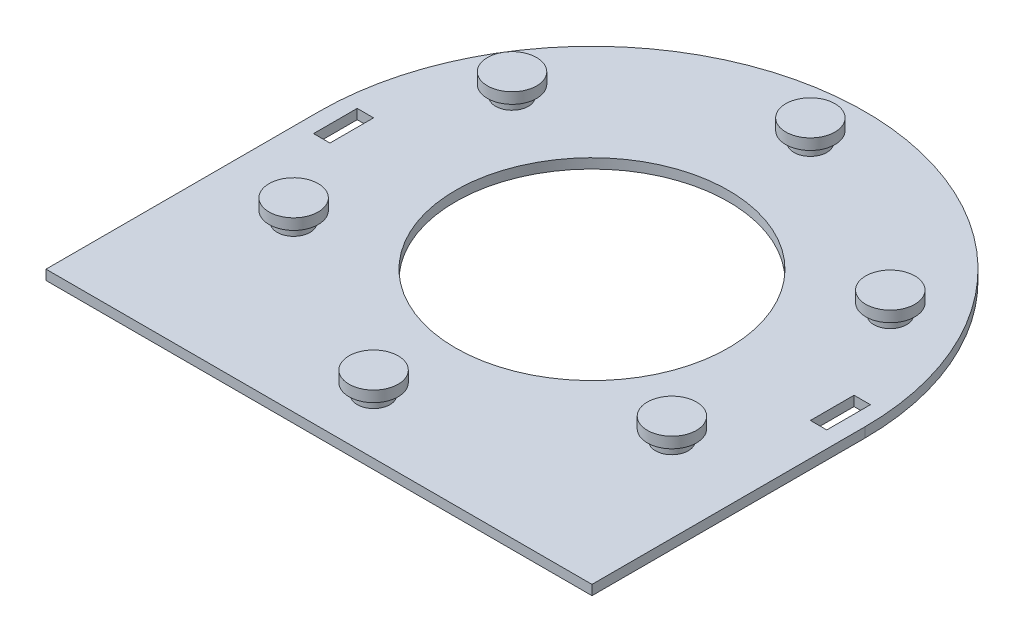
ISO-10303-21;
HEADER;
FILE_DESCRIPTION(('STEP AP214'),'2;1');
FILE_NAME('part.step','',(''),(''),'','','');
FILE_SCHEMA(('AUTOMOTIVE_DESIGN { 1 0 10303 214 1 1 1 1 }'));
ENDSEC;
DATA;
#1=APPLICATION_CONTEXT('core data for automotive mechanical design processes');
#2=APPLICATION_PROTOCOL_DEFINITION('international standard','automotive_design',2000,#1);
#3=PRODUCT_CONTEXT('',#1,'mechanical');
#4=PRODUCT('Part','Part','',(#3));
#5=PRODUCT_RELATED_PRODUCT_CATEGORY('part','',(#4));
#6=PRODUCT_DEFINITION_FORMATION('','',#4);
#7=PRODUCT_DEFINITION_CONTEXT('part definition',#1,'design');
#8=PRODUCT_DEFINITION('design','',#6,#7);
#9=PRODUCT_DEFINITION_SHAPE('','',#8);
#10=(LENGTH_UNIT() NAMED_UNIT(*) SI_UNIT(.MILLI.,.METRE.));
#11=(NAMED_UNIT(*) PLANE_ANGLE_UNIT() SI_UNIT($,.RADIAN.));
#12=(NAMED_UNIT(*) SI_UNIT($,.STERADIAN.) SOLID_ANGLE_UNIT());
#13=UNCERTAINTY_MEASURE_WITH_UNIT(LENGTH_MEASURE(1.E-05),#10,'distance_accuracy_value','');
#14=(GEOMETRIC_REPRESENTATION_CONTEXT(3) GLOBAL_UNCERTAINTY_ASSIGNED_CONTEXT((#13)) GLOBAL_UNIT_ASSIGNED_CONTEXT((#10,
#11,#12)) REPRESENTATION_CONTEXT('',''));
#15=CARTESIAN_POINT('',(0.,0.,0.));
#16=DIRECTION('',(0.,0.,1.));
#17=DIRECTION('',(1.,0.,0.));
#18=AXIS2_PLACEMENT_3D('',#15,#16,#17);
#19=CARTESIAN_POINT('',(50.,1.8,0.));
#20=DIRECTION('',(1.,0.,0.));
#21=DIRECTION('',(0.,0.,-1.));
#22=AXIS2_PLACEMENT_3D('',#19,#20,#21);
#23=PLANE('',#22);
#24=DIRECTION('',(0.,0.,1.));
#25=VECTOR('',#24,1.);
#26=CARTESIAN_POINT('',(50.,0.,0.));
#27=LINE('',#26,#25);
#28=CARTESIAN_POINT('',(50.,0.,0.));
#29=VERTEX_POINT('',#28);
#30=CARTESIAN_POINT('',(50.,0.,50.));
#31=VERTEX_POINT('',#30);
#32=EDGE_CURVE('E301',#29,#31,#27,.T.);
#33=ORIENTED_EDGE('',*,*,#32,.F.);
#34=DIRECTION('',(0.,-1.,0.));
#35=VECTOR('',#34,1.);
#36=CARTESIAN_POINT('',(50.,1.8,0.));
#37=LINE('',#36,#35);
#38=CARTESIAN_POINT('',(50.,1.8,0.));
#39=VERTEX_POINT('',#38);
#40=EDGE_CURVE('E12',#39,#29,#37,.T.);
#41=ORIENTED_EDGE('',*,*,#40,.F.);
#42=DIRECTION('',(0.,0.,1.));
#43=VECTOR('',#42,1.);
#44=CARTESIAN_POINT('',(50.,1.8,0.));
#45=LINE('',#44,#43);
#46=CARTESIAN_POINT('',(50.,1.8,50.));
#47=VERTEX_POINT('',#46);
#48=EDGE_CURVE('E302',#39,#47,#45,.T.);
#49=ORIENTED_EDGE('',*,*,#48,.T.);
#50=DIRECTION('',(0.,-1.,0.));
#51=VECTOR('',#50,1.);
#52=CARTESIAN_POINT('',(50.,1.8,50.));
#53=LINE('',#52,#51);
#54=EDGE_CURVE('E74',#47,#31,#53,.T.);
#55=ORIENTED_EDGE('',*,*,#54,.T.);
#56=EDGE_LOOP('',(#33,#41,#49,#55));
#57=FACE_BOUND('',#56,.T.);
#58=ADVANCED_FACE('F71',(#57),#23,.T.);
#59=CARTESIAN_POINT('',(0.,1.8,0.));
#60=DIRECTION('',(0.,-1.,0.));
#61=DIRECTION('',(0.,0.,-1.));
#62=AXIS2_PLACEMENT_3D('',#59,#60,#61);
#63=CYLINDRICAL_SURFACE('',#62,50.);
#64=CARTESIAN_POINT('',(0.,0.,0.));
#65=DIRECTION('',(0.,1.,0.));
#66=DIRECTION('',(0.,0.,1.));
#67=AXIS2_PLACEMENT_3D('',#64,#65,#66);
#68=CIRCLE('',#67,50.);
#69=CARTESIAN_POINT('',(-50.,0.,0.));
#70=VERTEX_POINT('',#69);
#71=EDGE_CURVE('E306',#29,#70,#68,.T.);
#72=ORIENTED_EDGE('',*,*,#71,.T.);
#73=DIRECTION('',(0.,-1.,0.));
#74=VECTOR('',#73,1.);
#75=CARTESIAN_POINT('',(-50.,1.8,0.));
#76=LINE('',#75,#74);
#77=CARTESIAN_POINT('',(-50.,1.8,0.));
#78=VERTEX_POINT('',#77);
#79=EDGE_CURVE('E79',#78,#70,#76,.T.);
#80=ORIENTED_EDGE('',*,*,#79,.F.);
#81=CARTESIAN_POINT('',(0.,1.8,0.));
#82=DIRECTION('',(0.,1.,0.));
#83=DIRECTION('',(0.,0.,1.));
#84=AXIS2_PLACEMENT_3D('',#81,#82,#83);
#85=CIRCLE('',#84,50.);
#86=EDGE_CURVE('E310',#39,#78,#85,.T.);
#87=ORIENTED_EDGE('',*,*,#86,.F.);
#88=ORIENTED_EDGE('',*,*,#40,.T.);
#89=EDGE_LOOP('',(#72,#80,#87,#88));
#90=FACE_BOUND('',#89,.T.);
#91=ADVANCED_FACE('F338',(#90),#63,.T.);
#92=CARTESIAN_POINT('',(-50.,1.8,0.));
#93=DIRECTION('',(1.,0.,0.));
#94=DIRECTION('',(0.,0.,-1.));
#95=AXIS2_PLACEMENT_3D('',#92,#93,#94);
#96=PLANE('',#95);
#97=DIRECTION('',(0.,0.,1.));
#98=VECTOR('',#97,1.);
#99=CARTESIAN_POINT('',(-50.,0.,0.));
#100=LINE('',#99,#98);
#101=CARTESIAN_POINT('',(-50.,0.,50.));
#102=VERTEX_POINT('',#101);
#103=EDGE_CURVE('E317',#70,#102,#100,.T.);
#104=ORIENTED_EDGE('',*,*,#103,.T.);
#105=DIRECTION('',(0.,-1.,0.));
#106=VECTOR('',#105,1.);
#107=CARTESIAN_POINT('',(-50.,1.8,50.));
#108=LINE('',#107,#106);
#109=CARTESIAN_POINT('',(-50.,1.8,50.));
#110=VERTEX_POINT('',#109);
#111=EDGE_CURVE('E321',#110,#102,#108,.T.);
#112=ORIENTED_EDGE('',*,*,#111,.F.);
#113=DIRECTION('',(0.,0.,1.));
#114=VECTOR('',#113,1.);
#115=CARTESIAN_POINT('',(-50.,1.8,0.));
#116=LINE('',#115,#114);
#117=EDGE_CURVE('E308',#78,#110,#116,.T.);
#118=ORIENTED_EDGE('',*,*,#117,.F.);
#119=ORIENTED_EDGE('',*,*,#79,.T.);
#120=EDGE_LOOP('',(#104,#112,#118,#119));
#121=FACE_BOUND('',#120,.T.);
#122=ADVANCED_FACE('F342',(#121),#96,.F.);
#123=CARTESIAN_POINT('',(-50.,1.8,50.));
#124=DIRECTION('',(0.,0.,-1.));
#125=DIRECTION('',(-1.,0.,0.));
#126=AXIS2_PLACEMENT_3D('',#123,#124,#125);
#127=PLANE('',#126);
#128=DIRECTION('',(1.,0.,0.));
#129=VECTOR('',#128,1.);
#130=CARTESIAN_POINT('',(-50.,0.,50.));
#131=LINE('',#130,#129);
#132=EDGE_CURVE('E314',#102,#31,#131,.T.);
#133=ORIENTED_EDGE('',*,*,#132,.T.);
#134=ORIENTED_EDGE('',*,*,#54,.F.);
#135=DIRECTION('',(1.,0.,0.));
#136=VECTOR('',#135,1.);
#137=CARTESIAN_POINT('',(-50.,1.8,50.));
#138=LINE('',#137,#136);
#139=EDGE_CURVE('E305',#110,#47,#138,.T.);
#140=ORIENTED_EDGE('',*,*,#139,.F.);
#141=ORIENTED_EDGE('',*,*,#111,.T.);
#142=EDGE_LOOP('',(#133,#134,#140,#141));
#143=FACE_BOUND('',#142,.T.);
#144=ADVANCED_FACE('F331',(#143),#127,.F.);
#145=CARTESIAN_POINT('',(0.,1.8,0.));
#146=DIRECTION('',(0.,1.,0.));
#147=DIRECTION('',(0.,0.,1.));
#148=AXIS2_PLACEMENT_3D('',#145,#146,#147);
#149=PLANE('',#148);
#150=DIRECTION('',(0.,0.,1.));
#151=VECTOR('',#150,1.);
#152=CARTESIAN_POINT('',(-47.,1.8,-3.99999999999999));
#153=LINE('',#152,#151);
#154=CARTESIAN_POINT('',(-47.,1.8,-3.99999999999999));
#155=VERTEX_POINT('',#154);
#156=CARTESIAN_POINT('',(-47.,1.8,3.99999999999999));
#157=VERTEX_POINT('',#156);
#158=EDGE_CURVE('E87',#155,#157,#153,.T.);
#159=ORIENTED_EDGE('',*,*,#158,.F.);
#160=DIRECTION('',(-1.,0.,0.));
#161=VECTOR('',#160,1.);
#162=CARTESIAN_POINT('',(-47.,1.8,-3.99999999999999));
#163=LINE('',#162,#161);
#164=CARTESIAN_POINT('',(-44.,1.8,-4.00000000000001));
#165=VERTEX_POINT('',#164);
#166=EDGE_CURVE('E184',#165,#155,#163,.T.);
#167=ORIENTED_EDGE('',*,*,#166,.F.);
#168=DIRECTION('',(0.,0.,-1.));
#169=VECTOR('',#168,1.);
#170=CARTESIAN_POINT('',(-44.,1.8,-4.00000000000001));
#171=LINE('',#170,#169);
#172=CARTESIAN_POINT('',(-44.,1.8,3.99999999999999));
#173=VERTEX_POINT('',#172);
#174=EDGE_CURVE('E167',#173,#165,#171,.T.);
#175=ORIENTED_EDGE('',*,*,#174,.F.);
#176=DIRECTION('',(1.,0.,0.));
#177=VECTOR('',#176,1.);
#178=CARTESIAN_POINT('',(-47.,1.8,3.99999999999999));
#179=LINE('',#178,#177);
#180=EDGE_CURVE('E177',#157,#173,#179,.T.);
#181=ORIENTED_EDGE('',*,*,#180,.F.);
#182=EDGE_LOOP('',(#159,#167,#175,#181));
#183=FACE_BOUND('',#182,.T.);
#184=DIRECTION('',(0.,0.,-1.));
#185=VECTOR('',#184,1.);
#186=CARTESIAN_POINT('',(47.,1.8,-3.99999999999999));
#187=LINE('',#186,#185);
#188=CARTESIAN_POINT('',(47.,1.8,3.99999999999999));
#189=VERTEX_POINT('',#188);
#190=CARTESIAN_POINT('',(47.,1.8,-3.99999999999999));
#191=VERTEX_POINT('',#190);
#192=EDGE_CURVE('E95',#189,#191,#187,.T.);
#193=ORIENTED_EDGE('',*,*,#192,.F.);
#194=DIRECTION('',(1.,0.,0.));
#195=VECTOR('',#194,1.);
#196=CARTESIAN_POINT('',(47.,1.8,3.99999999999999));
#197=LINE('',#196,#195);
#198=CARTESIAN_POINT('',(44.,1.8,3.99999999999999));
#199=VERTEX_POINT('',#198);
#200=EDGE_CURVE('E213',#199,#189,#197,.T.);
#201=ORIENTED_EDGE('',*,*,#200,.F.);
#202=DIRECTION('',(0.,0.,1.));
#203=VECTOR('',#202,1.);
#204=CARTESIAN_POINT('',(44.,1.8,-4.00000000000001));
#205=LINE('',#204,#203);
#206=CARTESIAN_POINT('',(44.,1.8,-4.00000000000001));
#207=VERTEX_POINT('',#206);
#208=EDGE_CURVE('E210',#207,#199,#205,.T.);
#209=ORIENTED_EDGE('',*,*,#208,.F.);
#210=DIRECTION('',(-1.,0.,0.));
#211=VECTOR('',#210,1.);
#212=CARTESIAN_POINT('',(47.,1.8,-3.99999999999999));
#213=LINE('',#212,#211);
#214=EDGE_CURVE('E207',#191,#207,#213,.T.);
#215=ORIENTED_EDGE('',*,*,#214,.F.);
#216=EDGE_LOOP('',(#193,#201,#209,#215));
#217=FACE_BOUND('',#216,.T.);
#218=CARTESIAN_POINT('',(0.,1.8,0.));
#219=DIRECTION('',(0.,1.,0.));
#220=DIRECTION('',(0.,0.,1.));
#221=AXIS2_PLACEMENT_3D('',#218,#219,#220);
#222=CIRCLE('',#221,25.);
#223=CARTESIAN_POINT('',(0.,1.8,25.));
#224=VERTEX_POINT('',#223);
#225=EDGE_CURVE('E295',#224,#224,#222,.T.);
#226=ORIENTED_EDGE('',*,*,#225,.F.);
#227=EDGE_LOOP('',(#226));
#228=FACE_BOUND('',#227,.T.);
#229=ORIENTED_EDGE('',*,*,#48,.F.);
#230=ORIENTED_EDGE('',*,*,#86,.T.);
#231=ORIENTED_EDGE('',*,*,#117,.T.);
#232=ORIENTED_EDGE('',*,*,#139,.T.);
#233=EDGE_LOOP('',(#229,#230,#231,#232));
#234=FACE_BOUND('',#233,.T.);
#235=CARTESIAN_POINT('',(0.,1.8,40.));
#236=DIRECTION('',(0.,1.,0.));
#237=DIRECTION('',(0.,0.,1.));
#238=AXIS2_PLACEMENT_3D('',#235,#236,#237);
#239=CIRCLE('',#238,3.);
#240=CARTESIAN_POINT('',(0.,1.8,43.));
#241=VERTEX_POINT('',#240);
#242=EDGE_CURVE('E283',#241,#241,#239,.T.);
#243=ORIENTED_EDGE('',*,*,#242,.F.);
#244=EDGE_LOOP('',(#243));
#245=FACE_BOUND('',#244,.T.);
#246=CARTESIAN_POINT('',(-34.6410161513773,1.8,20.0000000000004));
#247=DIRECTION('',(0.,1.,0.));
#248=DIRECTION('',(-0.866025403784433,0.,0.50000000000001));
#249=AXIS2_PLACEMENT_3D('',#246,#247,#248);
#250=CIRCLE('',#249,3.);
#251=CARTESIAN_POINT('',(-37.2390923627306,1.8,21.5000000000004));
#252=VERTEX_POINT('',#251);
#253=EDGE_CURVE('E195',#252,#252,#250,.T.);
#254=ORIENTED_EDGE('',*,*,#253,.F.);
#255=EDGE_LOOP('',(#254));
#256=FACE_BOUND('',#255,.T.);
#257=CARTESIAN_POINT('',(-34.6410161513777,1.8,-19.9999999999997));
#258=DIRECTION('',(0.,1.,0.));
#259=DIRECTION('',(-0.866025403784443,0.,-0.499999999999992));
#260=AXIS2_PLACEMENT_3D('',#257,#258,#259);
#261=CIRCLE('',#260,3.);
#262=CARTESIAN_POINT('',(-37.2390923627311,1.8,-21.4999999999997));
#263=VERTEX_POINT('',#262);
#264=EDGE_CURVE('E247',#263,#263,#261,.T.);
#265=ORIENTED_EDGE('',*,*,#264,.F.);
#266=EDGE_LOOP('',(#265));
#267=FACE_BOUND('',#266,.T.);
#268=CARTESIAN_POINT('',(0.,1.8,-40.));
#269=DIRECTION('',(0.,1.,0.));
#270=DIRECTION('',(0.,0.,-1.));
#271=AXIS2_PLACEMENT_3D('',#268,#269,#270);
#272=CIRCLE('',#271,3.);
#273=CARTESIAN_POINT('',(0.,1.8,-43.));
#274=VERTEX_POINT('',#273);
#275=EDGE_CURVE('E238',#274,#274,#272,.T.);
#276=ORIENTED_EDGE('',*,*,#275,.F.);
#277=EDGE_LOOP('',(#276));
#278=FACE_BOUND('',#277,.T.);
#279=CARTESIAN_POINT('',(34.6410161513775,1.8,-20.0000000000002));
#280=DIRECTION('',(0.,1.,0.));
#281=DIRECTION('',(0.866025403784436,0.,-0.500000000000004));
#282=AXIS2_PLACEMENT_3D('',#279,#280,#281);
#283=CIRCLE('',#282,3.);
#284=CARTESIAN_POINT('',(37.2390923627308,1.8,-21.5000000000002));
#285=VERTEX_POINT('',#284);
#286=EDGE_CURVE('E228',#285,#285,#283,.T.);
#287=ORIENTED_EDGE('',*,*,#286,.F.);
#288=EDGE_LOOP('',(#287));
#289=FACE_BOUND('',#288,.T.);
#290=CARTESIAN_POINT('',(34.6410161513776,1.8,19.9999999999999));
#291=DIRECTION('',(0.,1.,0.));
#292=DIRECTION('',(0.86602540378444,0.,0.499999999999998));
#293=AXIS2_PLACEMENT_3D('',#290,#291,#292);
#294=CIRCLE('',#293,3.);
#295=CARTESIAN_POINT('',(37.2390923627309,1.8,21.4999999999999));
#296=VERTEX_POINT('',#295);
#297=EDGE_CURVE('E234',#296,#296,#294,.T.);
#298=ORIENTED_EDGE('',*,*,#297,.F.);
#299=EDGE_LOOP('',(#298));
#300=FACE_BOUND('',#299,.T.);
#301=ADVANCED_FACE('F181',(#183,#217,#228,#234,#245,#256,#267,#278,#289,#300),#149,.T.);
#302=CARTESIAN_POINT('',(0.,0.,0.));
#303=DIRECTION('',(0.,1.,0.));
#304=DIRECTION('',(0.,0.,1.));
#305=AXIS2_PLACEMENT_3D('',#302,#303,#304);
#306=PLANE('',#305);
#307=DIRECTION('',(1.,0.,0.));
#308=VECTOR('',#307,1.);
#309=CARTESIAN_POINT('',(-47.,0.,-3.99999999999999));
#310=LINE('',#309,#308);
#311=CARTESIAN_POINT('',(-47.,0.,-3.99999999999999));
#312=VERTEX_POINT('',#311);
#313=CARTESIAN_POINT('',(-44.,0.,-4.00000000000001));
#314=VERTEX_POINT('',#313);
#315=EDGE_CURVE('E671',#312,#314,#310,.T.);
#316=ORIENTED_EDGE('',*,*,#315,.F.);
#317=DIRECTION('',(0.,0.,-1.));
#318=VECTOR('',#317,1.);
#319=CARTESIAN_POINT('',(-47.,0.,-3.99999999999999));
#320=LINE('',#319,#318);
#321=CARTESIAN_POINT('',(-47.,0.,3.99999999999999));
#322=VERTEX_POINT('',#321);
#323=EDGE_CURVE('E196',#322,#312,#320,.T.);
#324=ORIENTED_EDGE('',*,*,#323,.F.);
#325=DIRECTION('',(-1.,0.,0.));
#326=VECTOR('',#325,1.);
#327=CARTESIAN_POINT('',(-47.,0.,3.99999999999999));
#328=LINE('',#327,#326);
#329=CARTESIAN_POINT('',(-44.,0.,3.99999999999999));
#330=VERTEX_POINT('',#329);
#331=EDGE_CURVE('E193',#330,#322,#328,.T.);
#332=ORIENTED_EDGE('',*,*,#331,.F.);
#333=DIRECTION('',(0.,0.,1.));
#334=VECTOR('',#333,1.);
#335=CARTESIAN_POINT('',(-44.,0.,-4.00000000000001));
#336=LINE('',#335,#334);
#337=EDGE_CURVE('E170',#314,#330,#336,.T.);
#338=ORIENTED_EDGE('',*,*,#337,.F.);
#339=EDGE_LOOP('',(#316,#324,#332,#338));
#340=FACE_BOUND('',#339,.T.);
#341=DIRECTION('',(-1.,0.,0.));
#342=VECTOR('',#341,1.);
#343=CARTESIAN_POINT('',(47.,0.,3.99999999999999));
#344=LINE('',#343,#342);
#345=CARTESIAN_POINT('',(47.,0.,3.99999999999999));
#346=VERTEX_POINT('',#345);
#347=CARTESIAN_POINT('',(44.,0.,3.99999999999999));
#348=VERTEX_POINT('',#347);
#349=EDGE_CURVE('E200',#346,#348,#344,.T.);
#350=ORIENTED_EDGE('',*,*,#349,.F.);
#351=DIRECTION('',(0.,0.,1.));
#352=VECTOR('',#351,1.);
#353=CARTESIAN_POINT('',(47.,0.,-3.99999999999999));
#354=LINE('',#353,#352);
#355=CARTESIAN_POINT('',(47.,0.,-3.99999999999999));
#356=VERTEX_POINT('',#355);
#357=EDGE_CURVE('E203',#356,#346,#354,.T.);
#358=ORIENTED_EDGE('',*,*,#357,.F.);
#359=DIRECTION('',(1.,0.,0.));
#360=VECTOR('',#359,1.);
#361=CARTESIAN_POINT('',(47.,0.,-3.99999999999999));
#362=LINE('',#361,#360);
#363=CARTESIAN_POINT('',(44.,0.,-4.00000000000001));
#364=VERTEX_POINT('',#363);
#365=EDGE_CURVE('E205',#364,#356,#362,.T.);
#366=ORIENTED_EDGE('',*,*,#365,.F.);
#367=DIRECTION('',(0.,0.,-1.));
#368=VECTOR('',#367,1.);
#369=CARTESIAN_POINT('',(44.,0.,-4.00000000000001));
#370=LINE('',#369,#368);
#371=EDGE_CURVE('E197',#348,#364,#370,.T.);
#372=ORIENTED_EDGE('',*,*,#371,.F.);
#373=EDGE_LOOP('',(#350,#358,#366,#372));
#374=FACE_BOUND('',#373,.T.);
#375=CARTESIAN_POINT('',(0.,0.,0.));
#376=DIRECTION('',(0.,1.,0.));
#377=DIRECTION('',(0.,0.,1.));
#378=AXIS2_PLACEMENT_3D('',#375,#376,#377);
#379=CIRCLE('',#378,25.);
#380=CARTESIAN_POINT('',(0.,0.,25.));
#381=VERTEX_POINT('',#380);
#382=EDGE_CURVE('E298',#381,#381,#379,.F.);
#383=ORIENTED_EDGE('',*,*,#382,.F.);
#384=EDGE_LOOP('',(#383));
#385=FACE_BOUND('',#384,.T.);
#386=ORIENTED_EDGE('',*,*,#32,.T.);
#387=ORIENTED_EDGE('',*,*,#132,.F.);
#388=ORIENTED_EDGE('',*,*,#103,.F.);
#389=ORIENTED_EDGE('',*,*,#71,.F.);
#390=EDGE_LOOP('',(#386,#387,#388,#389));
#391=FACE_BOUND('',#390,.T.);
#392=ADVANCED_FACE('F335',(#340,#374,#385,#391),#306,.F.);
#393=CARTESIAN_POINT('',(0.,-70.7106781186548,0.));
#394=DIRECTION('',(0.,1.,0.));
#395=DIRECTION('',(0.,0.,1.));
#396=AXIS2_PLACEMENT_3D('',#393,#394,#395);
#397=CYLINDRICAL_SURFACE('',#396,25.);
#398=ORIENTED_EDGE('',*,*,#382,.T.);
#399=EDGE_LOOP('',(#398));
#400=FACE_BOUND('',#399,.T.);
#401=ORIENTED_EDGE('',*,*,#225,.T.);
#402=EDGE_LOOP('',(#401));
#403=FACE_BOUND('',#402,.T.);
#404=ADVANCED_FACE('F404',(#400,#403),#397,.F.);
#405=CARTESIAN_POINT('',(0.,3.8,40.));
#406=DIRECTION('',(0.,1.,0.));
#407=DIRECTION('',(0.,0.,1.));
#408=AXIS2_PLACEMENT_3D('',#405,#406,#407);
#409=PLANE('',#408);
#410=CARTESIAN_POINT('',(0.,3.8,40.));
#411=DIRECTION('',(0.,1.,0.));
#412=DIRECTION('',(0.,0.,1.));
#413=AXIS2_PLACEMENT_3D('',#410,#411,#412);
#414=CIRCLE('',#413,4.5);
#415=CARTESIAN_POINT('',(0.,3.8,44.5));
#416=VERTEX_POINT('',#415);
#417=EDGE_CURVE('E287',#416,#416,#414,.T.);
#418=ORIENTED_EDGE('',*,*,#417,.F.);
#419=EDGE_LOOP('',(#418));
#420=FACE_BOUND('',#419,.T.);
#421=CARTESIAN_POINT('',(0.,3.8,40.));
#422=DIRECTION('',(0.,1.,0.));
#423=DIRECTION('',(0.,0.,1.));
#424=AXIS2_PLACEMENT_3D('',#421,#422,#423);
#425=CIRCLE('',#424,3.);
#426=CARTESIAN_POINT('',(0.,3.8,43.));
#427=VERTEX_POINT('',#426);
#428=EDGE_CURVE('E284',#427,#427,#425,.T.);
#429=ORIENTED_EDGE('',*,*,#428,.T.);
#430=EDGE_LOOP('',(#429));
#431=FACE_BOUND('',#430,.T.);
#432=ADVANCED_FACE('F411',(#420,#431),#409,.F.);
#433=CARTESIAN_POINT('',(0.,3.8,40.));
#434=DIRECTION('',(0.,-1.,0.));
#435=DIRECTION('',(0.,0.,-1.));
#436=AXIS2_PLACEMENT_3D('',#433,#434,#435);
#437=CYLINDRICAL_SURFACE('',#436,3.);
#438=ORIENTED_EDGE('',*,*,#428,.F.);
#439=EDGE_LOOP('',(#438));
#440=FACE_BOUND('',#439,.T.);
#441=ORIENTED_EDGE('',*,*,#242,.T.);
#442=EDGE_LOOP('',(#441));
#443=FACE_BOUND('',#442,.T.);
#444=ADVANCED_FACE('F420',(#440,#443),#437,.T.);
#445=CARTESIAN_POINT('',(0.,5.8,40.));
#446=DIRECTION('',(0.,1.,0.));
#447=DIRECTION('',(0.,0.,1.));
#448=AXIS2_PLACEMENT_3D('',#445,#446,#447);
#449=PLANE('',#448);
#450=CARTESIAN_POINT('',(0.,5.8,40.));
#451=DIRECTION('',(0.,1.,0.));
#452=DIRECTION('',(0.,0.,1.));
#453=AXIS2_PLACEMENT_3D('',#450,#451,#452);
#454=CIRCLE('',#453,4.5);
#455=CARTESIAN_POINT('',(0.,5.8,44.5));
#456=VERTEX_POINT('',#455);
#457=EDGE_CURVE('E292',#456,#456,#454,.T.);
#458=ORIENTED_EDGE('',*,*,#457,.T.);
#459=EDGE_LOOP('',(#458));
#460=FACE_BOUND('',#459,.T.);
#461=ADVANCED_FACE('F428',(#460),#449,.T.);
#462=CARTESIAN_POINT('',(0.,5.8,40.));
#463=DIRECTION('',(0.,-1.,0.));
#464=DIRECTION('',(0.,0.,-1.));
#465=AXIS2_PLACEMENT_3D('',#462,#463,#464);
#466=CYLINDRICAL_SURFACE('',#465,4.5);
#467=ORIENTED_EDGE('',*,*,#417,.T.);
#468=EDGE_LOOP('',(#467));
#469=FACE_BOUND('',#468,.T.);
#470=ORIENTED_EDGE('',*,*,#457,.F.);
#471=EDGE_LOOP('',(#470));
#472=FACE_BOUND('',#471,.T.);
#473=ADVANCED_FACE('F436',(#469,#472),#466,.T.);
#474=CARTESIAN_POINT('',(-34.6410161513773,3.8,20.0000000000004));
#475=DIRECTION('',(0.,1.,0.));
#476=DIRECTION('',(-0.866025403784433,0.,0.50000000000001));
#477=AXIS2_PLACEMENT_3D('',#474,#475,#476);
#478=PLANE('',#477);
#479=CARTESIAN_POINT('',(-34.6410161513773,3.8,20.0000000000004));
#480=DIRECTION('',(0.,1.,0.));
#481=DIRECTION('',(-0.866025403784433,0.,0.50000000000001));
#482=AXIS2_PLACEMENT_3D('',#479,#480,#481);
#483=CIRCLE('',#482,4.5);
#484=CARTESIAN_POINT('',(-38.5381304684073,3.8,22.2500000000004));
#485=VERTEX_POINT('',#484);
#486=EDGE_CURVE('E250',#485,#485,#483,.T.);
#487=ORIENTED_EDGE('',*,*,#486,.F.);
#488=EDGE_LOOP('',(#487));
#489=FACE_BOUND('',#488,.T.);
#490=CARTESIAN_POINT('',(-34.6410161513773,3.8,20.0000000000004));
#491=DIRECTION('',(0.,1.,0.));
#492=DIRECTION('',(-0.866025403784433,0.,0.50000000000001));
#493=AXIS2_PLACEMENT_3D('',#490,#491,#492);
#494=CIRCLE('',#493,3.);
#495=CARTESIAN_POINT('',(-37.2390923627306,3.8,21.5000000000004));
#496=VERTEX_POINT('',#495);
#497=EDGE_CURVE('E253',#496,#496,#494,.T.);
#498=ORIENTED_EDGE('',*,*,#497,.T.);
#499=EDGE_LOOP('',(#498));
#500=FACE_BOUND('',#499,.T.);
#501=ADVANCED_FACE('F443',(#489,#500),#478,.F.);
#502=CARTESIAN_POINT('',(-34.6410161513773,3.8,20.0000000000004));
#503=DIRECTION('',(0.,-1.,0.));
#504=DIRECTION('',(0.,0.,-1.));
#505=AXIS2_PLACEMENT_3D('',#502,#503,#504);
#506=CYLINDRICAL_SURFACE('',#505,3.);
#507=ORIENTED_EDGE('',*,*,#497,.F.);
#508=EDGE_LOOP('',(#507));
#509=FACE_BOUND('',#508,.T.);
#510=ORIENTED_EDGE('',*,*,#253,.T.);
#511=EDGE_LOOP('',(#510));
#512=FACE_BOUND('',#511,.T.);
#513=ADVANCED_FACE('F451',(#509,#512),#506,.T.);
#514=CARTESIAN_POINT('',(-34.6410161513773,5.8,20.0000000000004));
#515=DIRECTION('',(0.,1.,0.));
#516=DIRECTION('',(-0.866025403784433,0.,0.50000000000001));
#517=AXIS2_PLACEMENT_3D('',#514,#515,#516);
#518=PLANE('',#517);
#519=CARTESIAN_POINT('',(-34.6410161513773,5.8,20.0000000000004));
#520=DIRECTION('',(0.,1.,0.));
#521=DIRECTION('',(-0.866025403784433,0.,0.50000000000001));
#522=AXIS2_PLACEMENT_3D('',#519,#520,#521);
#523=CIRCLE('',#522,4.5);
#524=CARTESIAN_POINT('',(-38.5381304684073,5.8,22.2500000000004));
#525=VERTEX_POINT('',#524);
#526=EDGE_CURVE('E268',#525,#525,#523,.T.);
#527=ORIENTED_EDGE('',*,*,#526,.T.);
#528=EDGE_LOOP('',(#527));
#529=FACE_BOUND('',#528,.T.);
#530=ADVANCED_FACE('F458',(#529),#518,.T.);
#531=CARTESIAN_POINT('',(-34.6410161513773,5.8,20.0000000000004));
#532=DIRECTION('',(0.,-1.,0.));
#533=DIRECTION('',(0.,0.,-1.));
#534=AXIS2_PLACEMENT_3D('',#531,#532,#533);
#535=CYLINDRICAL_SURFACE('',#534,4.5);
#536=ORIENTED_EDGE('',*,*,#486,.T.);
#537=EDGE_LOOP('',(#536));
#538=FACE_BOUND('',#537,.T.);
#539=ORIENTED_EDGE('',*,*,#526,.F.);
#540=EDGE_LOOP('',(#539));
#541=FACE_BOUND('',#540,.T.);
#542=ADVANCED_FACE('F466',(#538,#541),#535,.T.);
#543=CARTESIAN_POINT('',(-34.6410161513777,3.8,-19.9999999999997));
#544=DIRECTION('',(0.,1.,0.));
#545=DIRECTION('',(-0.866025403784443,0.,-0.499999999999992));
#546=AXIS2_PLACEMENT_3D('',#543,#544,#545);
#547=PLANE('',#546);
#548=CARTESIAN_POINT('',(-34.6410161513777,3.8,-19.9999999999997));
#549=DIRECTION('',(0.,1.,0.));
#550=DIRECTION('',(-0.866025403784443,0.,-0.499999999999992));
#551=AXIS2_PLACEMENT_3D('',#548,#549,#550);
#552=CIRCLE('',#551,4.5);
#553=CARTESIAN_POINT('',(-38.5381304684077,3.8,-22.2499999999996));
#554=VERTEX_POINT('',#553);
#555=EDGE_CURVE('E241',#554,#554,#552,.T.);
#556=ORIENTED_EDGE('',*,*,#555,.F.);
#557=EDGE_LOOP('',(#556));
#558=FACE_BOUND('',#557,.T.);
#559=CARTESIAN_POINT('',(-34.6410161513777,3.8,-19.9999999999997));
#560=DIRECTION('',(0.,1.,0.));
#561=DIRECTION('',(-0.866025403784443,0.,-0.499999999999992));
#562=AXIS2_PLACEMENT_3D('',#559,#560,#561);
#563=CIRCLE('',#562,3.);
#564=CARTESIAN_POINT('',(-37.2390923627311,3.8,-21.4999999999997));
#565=VERTEX_POINT('',#564);
#566=EDGE_CURVE('E244',#565,#565,#563,.T.);
#567=ORIENTED_EDGE('',*,*,#566,.T.);
#568=EDGE_LOOP('',(#567));
#569=FACE_BOUND('',#568,.T.);
#570=ADVANCED_FACE('F474',(#558,#569),#547,.F.);
#571=CARTESIAN_POINT('',(-34.6410161513777,3.8,-19.9999999999997));
#572=DIRECTION('',(0.,-1.,0.));
#573=DIRECTION('',(0.,0.,-1.));
#574=AXIS2_PLACEMENT_3D('',#571,#572,#573);
#575=CYLINDRICAL_SURFACE('',#574,3.);
#576=ORIENTED_EDGE('',*,*,#566,.F.);
#577=EDGE_LOOP('',(#576));
#578=FACE_BOUND('',#577,.T.);
#579=ORIENTED_EDGE('',*,*,#264,.T.);
#580=EDGE_LOOP('',(#579));
#581=FACE_BOUND('',#580,.T.);
#582=ADVANCED_FACE('F482',(#578,#581),#575,.T.);
#583=CARTESIAN_POINT('',(-34.6410161513777,5.8,-19.9999999999997));
#584=DIRECTION('',(0.,1.,0.));
#585=DIRECTION('',(-0.866025403784443,0.,-0.499999999999992));
#586=AXIS2_PLACEMENT_3D('',#583,#584,#585);
#587=PLANE('',#586);
#588=CARTESIAN_POINT('',(-34.6410161513777,5.8,-19.9999999999997));
#589=DIRECTION('',(0.,1.,0.));
#590=DIRECTION('',(-0.866025403784443,0.,-0.499999999999992));
#591=AXIS2_PLACEMENT_3D('',#588,#589,#590);
#592=CIRCLE('',#591,4.5);
#593=CARTESIAN_POINT('',(-38.5381304684077,5.8,-22.2499999999996));
#594=VERTEX_POINT('',#593);
#595=EDGE_CURVE('E271',#594,#594,#592,.T.);
#596=ORIENTED_EDGE('',*,*,#595,.T.);
#597=EDGE_LOOP('',(#596));
#598=FACE_BOUND('',#597,.T.);
#599=ADVANCED_FACE('F490',(#598),#587,.T.);
#600=CARTESIAN_POINT('',(-34.6410161513777,5.8,-19.9999999999997));
#601=DIRECTION('',(0.,-1.,0.));
#602=DIRECTION('',(0.,0.,-1.));
#603=AXIS2_PLACEMENT_3D('',#600,#601,#602);
#604=CYLINDRICAL_SURFACE('',#603,4.5);
#605=ORIENTED_EDGE('',*,*,#555,.T.);
#606=EDGE_LOOP('',(#605));
#607=FACE_BOUND('',#606,.T.);
#608=ORIENTED_EDGE('',*,*,#595,.F.);
#609=EDGE_LOOP('',(#608));
#610=FACE_BOUND('',#609,.T.);
#611=ADVANCED_FACE('F498',(#607,#610),#604,.T.);
#612=CARTESIAN_POINT('',(0.,3.8,-40.));
#613=DIRECTION('',(0.,1.,0.));
#614=DIRECTION('',(0.,0.,-1.));
#615=AXIS2_PLACEMENT_3D('',#612,#613,#614);
#616=PLANE('',#615);
#617=CARTESIAN_POINT('',(0.,3.8,-40.));
#618=DIRECTION('',(0.,1.,0.));
#619=DIRECTION('',(0.,0.,-1.));
#620=AXIS2_PLACEMENT_3D('',#617,#618,#619);
#621=CIRCLE('',#620,4.5);
#622=CARTESIAN_POINT('',(0.,3.8,-44.5));
#623=VERTEX_POINT('',#622);
#624=EDGE_CURVE('E231',#623,#623,#621,.T.);
#625=ORIENTED_EDGE('',*,*,#624,.F.);
#626=EDGE_LOOP('',(#625));
#627=FACE_BOUND('',#626,.T.);
#628=CARTESIAN_POINT('',(0.,3.8,-40.));
#629=DIRECTION('',(0.,1.,0.));
#630=DIRECTION('',(0.,0.,-1.));
#631=AXIS2_PLACEMENT_3D('',#628,#629,#630);
#632=CIRCLE('',#631,3.);
#633=CARTESIAN_POINT('',(0.,3.8,-43.));
#634=VERTEX_POINT('',#633);
#635=EDGE_CURVE('E235',#634,#634,#632,.T.);
#636=ORIENTED_EDGE('',*,*,#635,.T.);
#637=EDGE_LOOP('',(#636));
#638=FACE_BOUND('',#637,.T.);
#639=ADVANCED_FACE('F506',(#627,#638),#616,.F.);
#640=CARTESIAN_POINT('',(0.,3.8,-40.));
#641=DIRECTION('',(0.,-1.,0.));
#642=DIRECTION('',(0.,0.,-1.));
#643=AXIS2_PLACEMENT_3D('',#640,#641,#642);
#644=CYLINDRICAL_SURFACE('',#643,3.);
#645=ORIENTED_EDGE('',*,*,#635,.F.);
#646=EDGE_LOOP('',(#645));
#647=FACE_BOUND('',#646,.T.);
#648=ORIENTED_EDGE('',*,*,#275,.T.);
#649=EDGE_LOOP('',(#648));
#650=FACE_BOUND('',#649,.T.);
#651=ADVANCED_FACE('F514',(#647,#650),#644,.T.);
#652=CARTESIAN_POINT('',(0.,5.8,-40.));
#653=DIRECTION('',(0.,1.,0.));
#654=DIRECTION('',(0.,0.,-1.));
#655=AXIS2_PLACEMENT_3D('',#652,#653,#654);
#656=PLANE('',#655);
#657=CARTESIAN_POINT('',(0.,5.8,-40.));
#658=DIRECTION('',(0.,1.,0.));
#659=DIRECTION('',(0.,0.,-1.));
#660=AXIS2_PLACEMENT_3D('',#657,#658,#659);
#661=CIRCLE('',#660,4.5);
#662=CARTESIAN_POINT('',(0.,5.8,-44.5));
#663=VERTEX_POINT('',#662);
#664=EDGE_CURVE('E274',#663,#663,#661,.T.);
#665=ORIENTED_EDGE('',*,*,#664,.T.);
#666=EDGE_LOOP('',(#665));
#667=FACE_BOUND('',#666,.T.);
#668=ADVANCED_FACE('F522',(#667),#656,.T.);
#669=CARTESIAN_POINT('',(0.,5.8,-40.));
#670=DIRECTION('',(0.,-1.,0.));
#671=DIRECTION('',(0.,0.,-1.));
#672=AXIS2_PLACEMENT_3D('',#669,#670,#671);
#673=CYLINDRICAL_SURFACE('',#672,4.5);
#674=ORIENTED_EDGE('',*,*,#624,.T.);
#675=EDGE_LOOP('',(#674));
#676=FACE_BOUND('',#675,.T.);
#677=ORIENTED_EDGE('',*,*,#664,.F.);
#678=EDGE_LOOP('',(#677));
#679=FACE_BOUND('',#678,.T.);
#680=ADVANCED_FACE('F530',(#676,#679),#673,.T.);
#681=CARTESIAN_POINT('',(34.6410161513775,3.8,-20.0000000000002));
#682=DIRECTION('',(0.,1.,0.));
#683=DIRECTION('',(0.866025403784436,0.,-0.500000000000004));
#684=AXIS2_PLACEMENT_3D('',#681,#682,#683);
#685=PLANE('',#684);
#686=CARTESIAN_POINT('',(34.6410161513775,3.8,-20.0000000000002));
#687=DIRECTION('',(0.,1.,0.));
#688=DIRECTION('',(0.866025403784436,0.,-0.500000000000004));
#689=AXIS2_PLACEMENT_3D('',#686,#687,#688);
#690=CIRCLE('',#689,4.5);
#691=CARTESIAN_POINT('',(38.5381304684074,3.8,-22.2500000000002));
#692=VERTEX_POINT('',#691);
#693=EDGE_CURVE('E227',#692,#692,#690,.T.);
#694=ORIENTED_EDGE('',*,*,#693,.F.);
#695=EDGE_LOOP('',(#694));
#696=FACE_BOUND('',#695,.T.);
#697=CARTESIAN_POINT('',(34.6410161513775,3.8,-20.0000000000002));
#698=DIRECTION('',(0.,1.,0.));
#699=DIRECTION('',(0.866025403784436,0.,-0.500000000000004));
#700=AXIS2_PLACEMENT_3D('',#697,#698,#699);
#701=CIRCLE('',#700,3.);
#702=CARTESIAN_POINT('',(37.2390923627308,3.8,-21.5000000000002));
#703=VERTEX_POINT('',#702);
#704=EDGE_CURVE('E224',#703,#703,#701,.T.);
#705=ORIENTED_EDGE('',*,*,#704,.T.);
#706=EDGE_LOOP('',(#705));
#707=FACE_BOUND('',#706,.T.);
#708=ADVANCED_FACE('F538',(#696,#707),#685,.F.);
#709=CARTESIAN_POINT('',(34.6410161513775,3.8,-20.0000000000002));
#710=DIRECTION('',(0.,-1.,0.));
#711=DIRECTION('',(0.,0.,-1.));
#712=AXIS2_PLACEMENT_3D('',#709,#710,#711);
#713=CYLINDRICAL_SURFACE('',#712,3.);
#714=ORIENTED_EDGE('',*,*,#704,.F.);
#715=EDGE_LOOP('',(#714));
#716=FACE_BOUND('',#715,.T.);
#717=ORIENTED_EDGE('',*,*,#286,.T.);
#718=EDGE_LOOP('',(#717));
#719=FACE_BOUND('',#718,.T.);
#720=ADVANCED_FACE('F546',(#716,#719),#713,.T.);
#721=CARTESIAN_POINT('',(34.6410161513775,5.8,-20.0000000000002));
#722=DIRECTION('',(0.,1.,0.));
#723=DIRECTION('',(0.866025403784436,0.,-0.500000000000004));
#724=AXIS2_PLACEMENT_3D('',#721,#722,#723);
#725=PLANE('',#724);
#726=CARTESIAN_POINT('',(34.6410161513775,5.8,-20.0000000000002));
#727=DIRECTION('',(0.,1.,0.));
#728=DIRECTION('',(0.866025403784436,0.,-0.500000000000004));
#729=AXIS2_PLACEMENT_3D('',#726,#727,#728);
#730=CIRCLE('',#729,4.5);
#731=CARTESIAN_POINT('',(38.5381304684074,5.8,-22.2500000000002));
#732=VERTEX_POINT('',#731);
#733=EDGE_CURVE('E277',#732,#732,#730,.T.);
#734=ORIENTED_EDGE('',*,*,#733,.T.);
#735=EDGE_LOOP('',(#734));
#736=FACE_BOUND('',#735,.T.);
#737=ADVANCED_FACE('F554',(#736),#725,.T.);
#738=CARTESIAN_POINT('',(34.6410161513775,5.8,-20.0000000000002));
#739=DIRECTION('',(0.,-1.,0.));
#740=DIRECTION('',(0.,0.,-1.));
#741=AXIS2_PLACEMENT_3D('',#738,#739,#740);
#742=CYLINDRICAL_SURFACE('',#741,4.5);
#743=ORIENTED_EDGE('',*,*,#693,.T.);
#744=EDGE_LOOP('',(#743));
#745=FACE_BOUND('',#744,.T.);
#746=ORIENTED_EDGE('',*,*,#733,.F.);
#747=EDGE_LOOP('',(#746));
#748=FACE_BOUND('',#747,.T.);
#749=ADVANCED_FACE('F372',(#745,#748),#742,.T.);
#750=CARTESIAN_POINT('',(34.6410161513776,3.8,19.9999999999999));
#751=DIRECTION('',(0.,1.,0.));
#752=DIRECTION('',(0.86602540378444,0.,0.499999999999998));
#753=AXIS2_PLACEMENT_3D('',#750,#751,#752);
#754=PLANE('',#753);
#755=CARTESIAN_POINT('',(34.6410161513776,3.8,19.9999999999999));
#756=DIRECTION('',(0.,1.,0.));
#757=DIRECTION('',(0.86602540378444,0.,0.499999999999998));
#758=AXIS2_PLACEMENT_3D('',#755,#756,#757);
#759=CIRCLE('',#758,4.5);
#760=CARTESIAN_POINT('',(38.5381304684076,3.8,22.2499999999999));
#761=VERTEX_POINT('',#760);
#762=EDGE_CURVE('E263',#761,#761,#759,.T.);
#763=ORIENTED_EDGE('',*,*,#762,.F.);
#764=EDGE_LOOP('',(#763));
#765=FACE_BOUND('',#764,.T.);
#766=CARTESIAN_POINT('',(34.6410161513776,3.8,19.9999999999999));
#767=DIRECTION('',(0.,1.,0.));
#768=DIRECTION('',(0.86602540378444,0.,0.499999999999998));
#769=AXIS2_PLACEMENT_3D('',#766,#767,#768);
#770=CIRCLE('',#769,3.);
#771=CARTESIAN_POINT('',(37.2390923627309,3.8,21.4999999999999));
#772=VERTEX_POINT('',#771);
#773=EDGE_CURVE('E260',#772,#772,#770,.T.);
#774=ORIENTED_EDGE('',*,*,#773,.T.);
#775=EDGE_LOOP('',(#774));
#776=FACE_BOUND('',#775,.T.);
#777=ADVANCED_FACE('F362',(#765,#776),#754,.F.);
#778=CARTESIAN_POINT('',(34.6410161513776,3.8,19.9999999999999));
#779=DIRECTION('',(0.,-1.,0.));
#780=DIRECTION('',(0.,0.,-1.));
#781=AXIS2_PLACEMENT_3D('',#778,#779,#780);
#782=CYLINDRICAL_SURFACE('',#781,3.);
#783=ORIENTED_EDGE('',*,*,#773,.F.);
#784=EDGE_LOOP('',(#783));
#785=FACE_BOUND('',#784,.T.);
#786=ORIENTED_EDGE('',*,*,#297,.T.);
#787=EDGE_LOOP('',(#786));
#788=FACE_BOUND('',#787,.T.);
#789=ADVANCED_FACE('F359',(#785,#788),#782,.T.);
#790=CARTESIAN_POINT('',(34.6410161513776,5.8,19.9999999999999));
#791=DIRECTION('',(0.,1.,0.));
#792=DIRECTION('',(0.86602540378444,0.,0.499999999999998));
#793=AXIS2_PLACEMENT_3D('',#790,#791,#792);
#794=PLANE('',#793);
#795=CARTESIAN_POINT('',(34.6410161513776,5.8,19.9999999999999));
#796=DIRECTION('',(0.,1.,0.));
#797=DIRECTION('',(0.86602540378444,0.,0.499999999999998));
#798=AXIS2_PLACEMENT_3D('',#795,#796,#797);
#799=CIRCLE('',#798,4.5);
#800=CARTESIAN_POINT('',(38.5381304684076,5.8,22.2499999999999));
#801=VERTEX_POINT('',#800);
#802=EDGE_CURVE('E280',#801,#801,#799,.T.);
#803=ORIENTED_EDGE('',*,*,#802,.T.);
#804=EDGE_LOOP('',(#803));
#805=FACE_BOUND('',#804,.T.);
#806=ADVANCED_FACE('F361',(#805),#794,.T.);
#807=CARTESIAN_POINT('',(34.6410161513776,5.8,19.9999999999999));
#808=DIRECTION('',(0.,-1.,0.));
#809=DIRECTION('',(0.,0.,-1.));
#810=AXIS2_PLACEMENT_3D('',#807,#808,#809);
#811=CYLINDRICAL_SURFACE('',#810,4.5);
#812=ORIENTED_EDGE('',*,*,#762,.T.);
#813=EDGE_LOOP('',(#812));
#814=FACE_BOUND('',#813,.T.);
#815=ORIENTED_EDGE('',*,*,#802,.F.);
#816=EDGE_LOOP('',(#815));
#817=FACE_BOUND('',#816,.T.);
#818=ADVANCED_FACE('F369',(#814,#817),#811,.T.);
#819=CARTESIAN_POINT('',(47.,-8.54400374531753,-3.99999999999999));
#820=DIRECTION('',(1.,0.,0.));
#821=DIRECTION('',(0.,0.,-1.));
#822=AXIS2_PLACEMENT_3D('',#819,#820,#821);
#823=PLANE('',#822);
#824=ORIENTED_EDGE('',*,*,#357,.T.);
#825=DIRECTION('',(0.,1.,0.));
#826=VECTOR('',#825,1.);
#827=CARTESIAN_POINT('',(47.,-8.54400374531753,3.99999999999999));
#828=LINE('',#827,#826);
#829=EDGE_CURVE('E201',#346,#189,#828,.T.);
#830=ORIENTED_EDGE('',*,*,#829,.T.);
#831=ORIENTED_EDGE('',*,*,#192,.T.);
#832=DIRECTION('',(0.,1.,0.));
#833=VECTOR('',#832,1.);
#834=CARTESIAN_POINT('',(47.,-8.54400374531753,-3.99999999999999));
#835=LINE('',#834,#833);
#836=EDGE_CURVE('E216',#356,#191,#835,.T.);
#837=ORIENTED_EDGE('',*,*,#836,.F.);
#838=EDGE_LOOP('',(#824,#830,#831,#837));
#839=FACE_BOUND('',#838,.T.);
#840=ADVANCED_FACE('F592',(#839),#823,.F.);
#841=CARTESIAN_POINT('',(47.,-8.54400374531753,3.99999999999999));
#842=DIRECTION('',(0.,0.,1.));
#843=DIRECTION('',(1.,0.,0.));
#844=AXIS2_PLACEMENT_3D('',#841,#842,#843);
#845=PLANE('',#844);
#846=ORIENTED_EDGE('',*,*,#349,.T.);
#847=DIRECTION('',(0.,1.,0.));
#848=VECTOR('',#847,1.);
#849=CARTESIAN_POINT('',(44.,-8.54400374531753,3.99999999999999));
#850=LINE('',#849,#848);
#851=EDGE_CURVE('E218',#348,#199,#850,.T.);
#852=ORIENTED_EDGE('',*,*,#851,.T.);
#853=ORIENTED_EDGE('',*,*,#200,.T.);
#854=ORIENTED_EDGE('',*,*,#829,.F.);
#855=EDGE_LOOP('',(#846,#852,#853,#854));
#856=FACE_BOUND('',#855,.T.);
#857=ADVANCED_FACE('F601',(#856),#845,.F.);
#858=CARTESIAN_POINT('',(44.,-8.54400374531753,-4.00000000000001));
#859=DIRECTION('',(-1.,0.,0.));
#860=DIRECTION('',(0.,0.,1.));
#861=AXIS2_PLACEMENT_3D('',#858,#859,#860);
#862=PLANE('',#861);
#863=ORIENTED_EDGE('',*,*,#371,.T.);
#864=DIRECTION('',(0.,1.,0.));
#865=VECTOR('',#864,1.);
#866=CARTESIAN_POINT('',(44.,-8.54400374531753,-4.00000000000001));
#867=LINE('',#866,#865);
#868=EDGE_CURVE('E220',#364,#207,#867,.T.);
#869=ORIENTED_EDGE('',*,*,#868,.T.);
#870=ORIENTED_EDGE('',*,*,#208,.T.);
#871=ORIENTED_EDGE('',*,*,#851,.F.);
#872=EDGE_LOOP('',(#863,#869,#870,#871));
#873=FACE_BOUND('',#872,.T.);
#874=ADVANCED_FACE('F607',(#873),#862,.F.);
#875=CARTESIAN_POINT('',(47.,-8.54400374531753,-3.99999999999999));
#876=DIRECTION('',(0.,0.,-1.));
#877=DIRECTION('',(-1.,0.,0.));
#878=AXIS2_PLACEMENT_3D('',#875,#876,#877);
#879=PLANE('',#878);
#880=ORIENTED_EDGE('',*,*,#365,.T.);
#881=ORIENTED_EDGE('',*,*,#836,.T.);
#882=ORIENTED_EDGE('',*,*,#214,.T.);
#883=ORIENTED_EDGE('',*,*,#868,.F.);
#884=EDGE_LOOP('',(#880,#881,#882,#883));
#885=FACE_BOUND('',#884,.T.);
#886=ADVANCED_FACE('F615',(#885),#879,.F.);
#887=CARTESIAN_POINT('',(-47.,-8.54400374531753,-3.99999999999999));
#888=DIRECTION('',(-1.,0.,0.));
#889=DIRECTION('',(0.,0.,1.));
#890=AXIS2_PLACEMENT_3D('',#887,#888,#889);
#891=PLANE('',#890);
#892=ORIENTED_EDGE('',*,*,#323,.T.);
#893=DIRECTION('',(0.,1.,0.));
#894=VECTOR('',#893,1.);
#895=CARTESIAN_POINT('',(-47.,-8.54400374531753,-3.99999999999999));
#896=LINE('',#895,#894);
#897=EDGE_CURVE('E189',#312,#155,#896,.T.);
#898=ORIENTED_EDGE('',*,*,#897,.T.);
#899=ORIENTED_EDGE('',*,*,#158,.T.);
#900=DIRECTION('',(0.,1.,0.));
#901=VECTOR('',#900,1.);
#902=CARTESIAN_POINT('',(-47.,-8.54400374531753,3.99999999999999));
#903=LINE('',#902,#901);
#904=EDGE_CURVE('E174',#322,#157,#903,.T.);
#905=ORIENTED_EDGE('',*,*,#904,.F.);
#906=EDGE_LOOP('',(#892,#898,#899,#905));
#907=FACE_BOUND('',#906,.T.);
#908=ADVANCED_FACE('F623',(#907),#891,.F.);
#909=CARTESIAN_POINT('',(-47.,-8.54400374531753,-3.99999999999999));
#910=DIRECTION('',(0.,0.,-1.));
#911=DIRECTION('',(-1.,0.,0.));
#912=AXIS2_PLACEMENT_3D('',#909,#910,#911);
#913=PLANE('',#912);
#914=ORIENTED_EDGE('',*,*,#315,.T.);
#915=DIRECTION('',(0.,1.,0.));
#916=VECTOR('',#915,1.);
#917=CARTESIAN_POINT('',(-44.,-8.54400374531753,-4.00000000000001));
#918=LINE('',#917,#916);
#919=EDGE_CURVE('E173',#314,#165,#918,.T.);
#920=ORIENTED_EDGE('',*,*,#919,.T.);
#921=ORIENTED_EDGE('',*,*,#166,.T.);
#922=ORIENTED_EDGE('',*,*,#897,.F.);
#923=EDGE_LOOP('',(#914,#920,#921,#922));
#924=FACE_BOUND('',#923,.T.);
#925=ADVANCED_FACE('F631',(#924),#913,.F.);
#926=CARTESIAN_POINT('',(-44.,-8.54400374531753,-4.00000000000001));
#927=DIRECTION('',(1.,0.,0.));
#928=DIRECTION('',(0.,0.,-1.));
#929=AXIS2_PLACEMENT_3D('',#926,#927,#928);
#930=PLANE('',#929);
#931=ORIENTED_EDGE('',*,*,#337,.T.);
#932=DIRECTION('',(0.,1.,0.));
#933=VECTOR('',#932,1.);
#934=CARTESIAN_POINT('',(-44.,-8.54400374531753,3.99999999999999));
#935=LINE('',#934,#933);
#936=EDGE_CURVE('E162',#330,#173,#935,.T.);
#937=ORIENTED_EDGE('',*,*,#936,.T.);
#938=ORIENTED_EDGE('',*,*,#174,.T.);
#939=ORIENTED_EDGE('',*,*,#919,.F.);
#940=EDGE_LOOP('',(#931,#937,#938,#939));
#941=FACE_BOUND('',#940,.T.);
#942=ADVANCED_FACE('F164',(#941),#930,.F.);
#943=CARTESIAN_POINT('',(-47.,-8.54400374531753,3.99999999999999));
#944=DIRECTION('',(0.,0.,1.));
#945=DIRECTION('',(1.,0.,0.));
#946=AXIS2_PLACEMENT_3D('',#943,#944,#945);
#947=PLANE('',#946);
#948=ORIENTED_EDGE('',*,*,#331,.T.);
#949=ORIENTED_EDGE('',*,*,#904,.T.);
#950=ORIENTED_EDGE('',*,*,#180,.T.);
#951=ORIENTED_EDGE('',*,*,#936,.F.);
#952=EDGE_LOOP('',(#948,#949,#950,#951));
#953=FACE_BOUND('',#952,.T.);
#954=ADVANCED_FACE('F178',(#953),#947,.F.);
#955=CLOSED_SHELL('',(#58,#91,#122,#144,#301,#392,#404,#432,#444,#461,#473,#501,#513,#530,#542,
#570,#582,#599,#611,#639,#651,#668,#680,#708,#720,#737,#749,#777,#789,#806,#818,#840,#857,#874,
#886,#908,#925,#942,#954));
#956=MANIFOLD_SOLID_BREP('B2',#955);
#957=ADVANCED_BREP_SHAPE_REPRESENTATION('',(#18,#956),#14);
#958=SHAPE_DEFINITION_REPRESENTATION(#9,#957);
ENDSEC;
END-ISO-10303-21;
